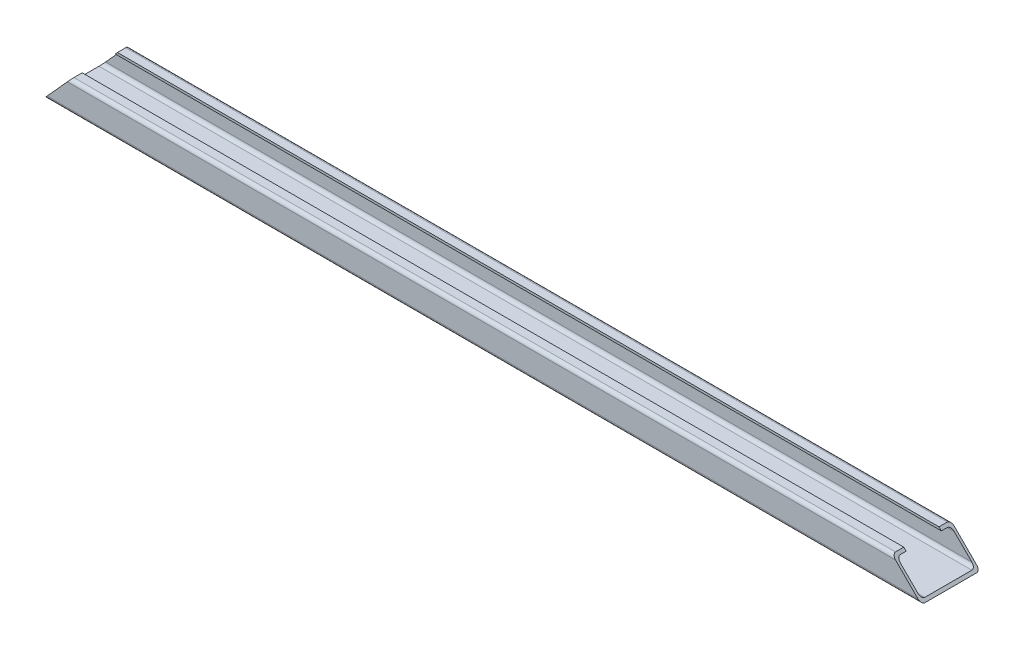
ISO-10303-21;
HEADER;
FILE_DESCRIPTION(('STEP AP214'),'2;1');
FILE_NAME('part.step','',(''),(''),'','','');
FILE_SCHEMA(('AUTOMOTIVE_DESIGN { 1 0 10303 214 1 1 1 1 }'));
ENDSEC;
DATA;
#1=APPLICATION_CONTEXT('core data for automotive mechanical design processes');
#2=APPLICATION_PROTOCOL_DEFINITION('international standard','automotive_design',2000,#1);
#3=PRODUCT_CONTEXT('',#1,'mechanical');
#4=PRODUCT('Part','Part','',(#3));
#5=PRODUCT_RELATED_PRODUCT_CATEGORY('part','',(#4));
#6=PRODUCT_DEFINITION_FORMATION('','',#4);
#7=PRODUCT_DEFINITION_CONTEXT('part definition',#1,'design');
#8=PRODUCT_DEFINITION('design','',#6,#7);
#9=PRODUCT_DEFINITION_SHAPE('','',#8);
#10=(LENGTH_UNIT() NAMED_UNIT(*) SI_UNIT(.MILLI.,.METRE.));
#11=(NAMED_UNIT(*) PLANE_ANGLE_UNIT() SI_UNIT($,.RADIAN.));
#12=(NAMED_UNIT(*) SI_UNIT($,.STERADIAN.) SOLID_ANGLE_UNIT());
#13=UNCERTAINTY_MEASURE_WITH_UNIT(LENGTH_MEASURE(1.E-05),#10,'distance_accuracy_value','');
#14=(GEOMETRIC_REPRESENTATION_CONTEXT(3) GLOBAL_UNCERTAINTY_ASSIGNED_CONTEXT((#13)) GLOBAL_UNIT_ASSIGNED_CONTEXT((#10,
#11,#12)) REPRESENTATION_CONTEXT('',''));
#15=CARTESIAN_POINT('',(0.,0.,0.));
#16=DIRECTION('',(0.,0.,1.));
#17=DIRECTION('',(1.,0.,0.));
#18=AXIS2_PLACEMENT_3D('',#15,#16,#17);
#19=CARTESIAN_POINT('',(1500.,25.,-50.));
#20=DIRECTION('',(0.,0.,1.));
#21=DIRECTION('',(0.,-1.,0.));
#22=AXIS2_PLACEMENT_3D('',#19,#20,#21);
#23=PLANE('',#22);
#24=DIRECTION('',(-1.,0.,0.));
#25=VECTOR('',#24,1.);
#26=CARTESIAN_POINT('',(1500.,-19.,-50.));
#27=LINE('',#26,#25);
#28=CARTESIAN_POINT('',(1494.,-19.,-50.));
#29=VERTEX_POINT('',#28);
#30=CARTESIAN_POINT('',(10.3822220508938,-19.,-50.));
#31=VERTEX_POINT('',#30);
#32=EDGE_CURVE('E197',#29,#31,#27,.T.);
#33=ORIENTED_EDGE('',*,*,#32,.T.);
#34=DIRECTION('',(0.669130606358863,0.74314482547739,0.));
#35=VECTOR('',#34,1.);
#36=CARTESIAN_POINT('',(49.9999999999994,25.,-50.));
#37=LINE('',#36,#35);
#38=CARTESIAN_POINT('',(44.5975757342123,19.,-50.));
#39=VERTEX_POINT('',#38);
#40=EDGE_CURVE('E176',#31,#39,#37,.T.);
#41=ORIENTED_EDGE('',*,*,#40,.T.);
#42=DIRECTION('',(-1.,0.,0.));
#43=VECTOR('',#42,1.);
#44=CARTESIAN_POINT('',(1500.,19.,-50.));
#45=LINE('',#44,#43);
#46=CARTESIAN_POINT('',(1456.,19.,-50.));
#47=VERTEX_POINT('',#46);
#48=EDGE_CURVE('E200',#39,#47,#45,.F.);
#49=ORIENTED_EDGE('',*,*,#48,.T.);
#50=DIRECTION('',(0.707106781186546,-0.707106781186549,0.));
#51=VECTOR('',#50,1.);
#52=CARTESIAN_POINT('',(1500.,-25.,-50.));
#53=LINE('',#52,#51);
#54=EDGE_CURVE('E255',#47,#29,#53,.T.);
#55=ORIENTED_EDGE('',*,*,#54,.T.);
#56=EDGE_LOOP('',(#33,#41,#49,#55));
#57=FACE_BOUND('',#56,.T.);
#58=ADVANCED_FACE('F32',(#57),#23,.F.);
#59=CARTESIAN_POINT('',(1500.,25.,-30.));
#60=DIRECTION('',(0.,-1.,0.));
#61=DIRECTION('',(0.,0.,-1.));
#62=AXIS2_PLACEMENT_3D('',#59,#60,#61);
#63=PLANE('',#62);
#64=DIRECTION('',(-1.,0.,0.));
#65=VECTOR('',#64,1.);
#66=CARTESIAN_POINT('',(1500.,25.,-44.));
#67=LINE('',#66,#65);
#68=CARTESIAN_POINT('',(1450.,25.,-44.));
#69=VERTEX_POINT('',#68);
#70=CARTESIAN_POINT('',(49.9999999999994,25.,-44.));
#71=VERTEX_POINT('',#70);
#72=EDGE_CURVE('E194',#69,#71,#67,.T.);
#73=ORIENTED_EDGE('',*,*,#72,.T.);
#74=DIRECTION('',(0.,0.,1.));
#75=VECTOR('',#74,1.);
#76=CARTESIAN_POINT('',(49.9999999999994,25.,-30.));
#77=LINE('',#76,#75);
#78=CARTESIAN_POINT('',(49.9999999999994,25.,-30.));
#79=VERTEX_POINT('',#78);
#80=EDGE_CURVE('E300',#71,#79,#77,.T.);
#81=ORIENTED_EDGE('',*,*,#80,.T.);
#82=DIRECTION('',(-1.,0.,0.));
#83=VECTOR('',#82,1.);
#84=CARTESIAN_POINT('',(1500.,25.,-30.));
#85=LINE('',#84,#83);
#86=CARTESIAN_POINT('',(1450.,25.,-30.));
#87=VERTEX_POINT('',#86);
#88=EDGE_CURVE('E317',#87,#79,#85,.T.);
#89=ORIENTED_EDGE('',*,*,#88,.F.);
#90=DIRECTION('',(0.,0.,-1.));
#91=VECTOR('',#90,1.);
#92=CARTESIAN_POINT('',(1450.,25.,-30.));
#93=LINE('',#92,#91);
#94=EDGE_CURVE('E288',#87,#69,#93,.T.);
#95=ORIENTED_EDGE('',*,*,#94,.T.);
#96=EDGE_LOOP('',(#73,#81,#89,#95));
#97=FACE_BOUND('',#96,.T.);
#98=ADVANCED_FACE('F359',(#97),#63,.F.);
#99=CARTESIAN_POINT('',(1500.,25.,-30.));
#100=DIRECTION('',(0.,0.,-1.));
#101=DIRECTION('',(-1.,0.,0.));
#102=AXIS2_PLACEMENT_3D('',#99,#100,#101);
#103=PLANE('',#102);
#104=ORIENTED_EDGE('',*,*,#88,.T.);
#105=DIRECTION('',(-0.669130606358863,-0.74314482547739,0.));
#106=VECTOR('',#105,1.);
#107=CARTESIAN_POINT('',(699.216864130961,746.028374142,-30.));
#108=LINE('',#107,#106);
#109=CARTESIAN_POINT('',(46.3983838228079,21.,-30.));
#110=VERTEX_POINT('',#109);
#111=EDGE_CURVE('E248',#79,#110,#108,.T.);
#112=ORIENTED_EDGE('',*,*,#111,.T.);
#113=DIRECTION('',(-1.,0.,0.));
#114=VECTOR('',#113,1.);
#115=CARTESIAN_POINT('',(1500.,21.,-30.));
#116=LINE('',#115,#114);
#117=CARTESIAN_POINT('',(1454.,21.,-30.));
#118=VERTEX_POINT('',#117);
#119=EDGE_CURVE('E314',#118,#110,#116,.T.);
#120=ORIENTED_EDGE('',*,*,#119,.F.);
#121=DIRECTION('',(-0.707106781186546,0.707106781186549,0.));
#122=VECTOR('',#121,1.);
#123=CARTESIAN_POINT('',(1475.,0.,-30.));
#124=LINE('',#123,#122);
#125=EDGE_CURVE('E285',#118,#87,#124,.T.);
#126=ORIENTED_EDGE('',*,*,#125,.T.);
#127=EDGE_LOOP('',(#104,#112,#120,#126));
#128=FACE_BOUND('',#127,.T.);
#129=ADVANCED_FACE('F361',(#128),#103,.F.);
#130=CARTESIAN_POINT('',(1500.,21.,-30.));
#131=DIRECTION('',(0.,1.,0.));
#132=DIRECTION('',(0.,0.,1.));
#133=AXIS2_PLACEMENT_3D('',#130,#131,#132);
#134=PLANE('',#133);
#135=ORIENTED_EDGE('',*,*,#119,.T.);
#136=DIRECTION('',(0.,0.,-1.));
#137=VECTOR('',#136,1.);
#138=CARTESIAN_POINT('',(46.3983838228079,21.,-30.));
#139=LINE('',#138,#137);
#140=CARTESIAN_POINT('',(46.3983838228079,21.,-40.));
#141=VERTEX_POINT('',#140);
#142=EDGE_CURVE('E245',#110,#141,#139,.T.);
#143=ORIENTED_EDGE('',*,*,#142,.T.);
#144=DIRECTION('',(-1.,0.,0.));
#145=VECTOR('',#144,1.);
#146=CARTESIAN_POINT('',(1500.,21.,-40.));
#147=LINE('',#146,#145);
#148=CARTESIAN_POINT('',(1454.,21.,-40.));
#149=VERTEX_POINT('',#148);
#150=EDGE_CURVE('E324',#141,#149,#147,.F.);
#151=ORIENTED_EDGE('',*,*,#150,.T.);
#152=DIRECTION('',(0.,0.,1.));
#153=VECTOR('',#152,1.);
#154=CARTESIAN_POINT('',(1454.,21.,-30.));
#155=LINE('',#154,#153);
#156=EDGE_CURVE('E282',#149,#118,#155,.T.);
#157=ORIENTED_EDGE('',*,*,#156,.T.);
#158=EDGE_LOOP('',(#135,#143,#151,#157));
#159=FACE_BOUND('',#158,.T.);
#160=ADVANCED_FACE('F365',(#159),#134,.F.);
#161=CARTESIAN_POINT('',(1500.,21.,-46.));
#162=DIRECTION('',(0.,0.,-1.));
#163=DIRECTION('',(0.,1.,0.));
#164=AXIS2_PLACEMENT_3D('',#161,#162,#163);
#165=PLANE('',#164);
#166=DIRECTION('',(-1.,0.,0.));
#167=VECTOR('',#166,1.);
#168=CARTESIAN_POINT('',(0.,15.,-46.));
#169=LINE('',#168,#167);
#170=CARTESIAN_POINT('',(1460.,15.,-46.));
#171=VERTEX_POINT('',#170);
#172=CARTESIAN_POINT('',(40.9959595570207,15.0000000000001,-46.));
#173=VERTEX_POINT('',#172);
#174=EDGE_CURVE('E321',#171,#173,#169,.T.);
#175=ORIENTED_EDGE('',*,*,#174,.T.);
#176=DIRECTION('',(-0.669130606358863,-0.74314482547739,0.));
#177=VECTOR('',#176,1.);
#178=CARTESIAN_POINT('',(697.227820340224,743.819317215464,-45.9999999999999));
#179=LINE('',#178,#177);
#180=CARTESIAN_POINT('',(13.983838228085,-15.,-46.));
#181=VERTEX_POINT('',#180);
#182=EDGE_CURVE('E237',#173,#181,#179,.T.);
#183=ORIENTED_EDGE('',*,*,#182,.T.);
#184=DIRECTION('',(-1.,0.,0.));
#185=VECTOR('',#184,1.);
#186=CARTESIAN_POINT('',(1500.,-15.,-46.));
#187=LINE('',#186,#185);
#188=CARTESIAN_POINT('',(1490.,-15.,-46.));
#189=VERTEX_POINT('',#188);
#190=EDGE_CURVE('E224',#181,#189,#187,.F.);
#191=ORIENTED_EDGE('',*,*,#190,.T.);
#192=DIRECTION('',(-0.707106781186546,0.707106781186549,0.));
#193=VECTOR('',#192,1.);
#194=CARTESIAN_POINT('',(1477.,-1.99999999999993,-46.));
#195=LINE('',#194,#193);
#196=EDGE_CURVE('E273',#189,#171,#195,.T.);
#197=ORIENTED_EDGE('',*,*,#196,.T.);
#198=EDGE_LOOP('',(#175,#183,#191,#197));
#199=FACE_BOUND('',#198,.T.);
#200=ADVANCED_FACE('F372',(#199),#165,.F.);
#201=CARTESIAN_POINT('',(1500.,-21.,46.));
#202=DIRECTION('',(0.,-1.,0.));
#203=DIRECTION('',(0.,0.,-1.));
#204=AXIS2_PLACEMENT_3D('',#201,#202,#203);
#205=PLANE('',#204);
#206=DIRECTION('',(-1.,0.,0.));
#207=VECTOR('',#206,1.);
#208=CARTESIAN_POINT('',(0.,-21.,-40.));
#209=LINE('',#208,#207);
#210=CARTESIAN_POINT('',(1496.,-21.,-40.));
#211=VERTEX_POINT('',#210);
#212=CARTESIAN_POINT('',(8.58141396229795,-21.,-40.));
#213=VERTEX_POINT('',#212);
#214=EDGE_CURVE('E40',#211,#213,#209,.T.);
#215=ORIENTED_EDGE('',*,*,#214,.T.);
#216=DIRECTION('',(0.,0.,1.));
#217=VECTOR('',#216,1.);
#218=CARTESIAN_POINT('',(8.58141396229795,-21.,46.));
#219=LINE('',#218,#217);
#220=CARTESIAN_POINT('',(8.58141396229795,-21.,40.));
#221=VERTEX_POINT('',#220);
#222=EDGE_CURVE('E213',#213,#221,#219,.T.);
#223=ORIENTED_EDGE('',*,*,#222,.T.);
#224=DIRECTION('',(-1.,0.,0.));
#225=VECTOR('',#224,1.);
#226=CARTESIAN_POINT('',(1500.,-21.,40.));
#227=LINE('',#226,#225);
#228=CARTESIAN_POINT('',(1496.,-21.,40.));
#229=VERTEX_POINT('',#228);
#230=EDGE_CURVE('E206',#221,#229,#227,.F.);
#231=ORIENTED_EDGE('',*,*,#230,.T.);
#232=DIRECTION('',(0.,0.,-1.));
#233=VECTOR('',#232,1.);
#234=CARTESIAN_POINT('',(1496.,-21.,46.));
#235=LINE('',#234,#233);
#236=EDGE_CURVE('E216',#229,#211,#235,.T.);
#237=ORIENTED_EDGE('',*,*,#236,.T.);
#238=EDGE_LOOP('',(#215,#223,#231,#237));
#239=FACE_BOUND('',#238,.T.);
#240=ADVANCED_FACE('F212',(#239),#205,.F.);
#241=CARTESIAN_POINT('',(1500.,21.,46.));
#242=DIRECTION('',(0.,0.,1.));
#243=DIRECTION('',(0.,-1.,0.));
#244=AXIS2_PLACEMENT_3D('',#241,#242,#243);
#245=PLANE('',#244);
#246=DIRECTION('',(-1.,0.,0.));
#247=VECTOR('',#246,1.);
#248=CARTESIAN_POINT('',(0.,-15.,46.));
#249=LINE('',#248,#247);
#250=CARTESIAN_POINT('',(1490.,-15.,46.));
#251=VERTEX_POINT('',#250);
#252=CARTESIAN_POINT('',(13.983838228085,-15.,46.));
#253=VERTEX_POINT('',#252);
#254=EDGE_CURVE('E188',#251,#253,#249,.T.);
#255=ORIENTED_EDGE('',*,*,#254,.T.);
#256=DIRECTION('',(0.669130606358863,0.74314482547739,0.));
#257=VECTOR('',#256,1.);
#258=CARTESIAN_POINT('',(697.227820340224,743.819317215464,46.0000000000001));
#259=LINE('',#258,#257);
#260=CARTESIAN_POINT('',(40.9959595570207,15.0000000000001,46.));
#261=VERTEX_POINT('',#260);
#262=EDGE_CURVE('E231',#253,#261,#259,.T.);
#263=ORIENTED_EDGE('',*,*,#262,.T.);
#264=DIRECTION('',(-1.,0.,0.));
#265=VECTOR('',#264,1.);
#266=CARTESIAN_POINT('',(1500.,15.,46.));
#267=LINE('',#266,#265);
#268=CARTESIAN_POINT('',(1460.,15.,46.));
#269=VERTEX_POINT('',#268);
#270=EDGE_CURVE('E184',#261,#269,#267,.F.);
#271=ORIENTED_EDGE('',*,*,#270,.T.);
#272=DIRECTION('',(0.707106781186546,-0.707106781186549,0.));
#273=VECTOR('',#272,1.);
#274=CARTESIAN_POINT('',(1477.,-1.99999999999993,46.));
#275=LINE('',#274,#273);
#276=EDGE_CURVE('E262',#269,#251,#275,.T.);
#277=ORIENTED_EDGE('',*,*,#276,.T.);
#278=EDGE_LOOP('',(#255,#263,#271,#277));
#279=FACE_BOUND('',#278,.T.);
#280=ADVANCED_FACE('F332',(#279),#245,.F.);
#281=CARTESIAN_POINT('',(1500.,21.,46.));
#282=DIRECTION('',(0.,1.,0.));
#283=DIRECTION('',(0.,0.,1.));
#284=AXIS2_PLACEMENT_3D('',#281,#282,#283);
#285=PLANE('',#284);
#286=DIRECTION('',(-1.,0.,0.));
#287=VECTOR('',#286,1.);
#288=CARTESIAN_POINT('',(0.,21.,40.));
#289=LINE('',#288,#287);
#290=CARTESIAN_POINT('',(1454.,21.,40.));
#291=VERTEX_POINT('',#290);
#292=CARTESIAN_POINT('',(46.3983838228077,21.,40.));
#293=VERTEX_POINT('',#292);
#294=EDGE_CURVE('E326',#291,#293,#289,.T.);
#295=ORIENTED_EDGE('',*,*,#294,.T.);
#296=DIRECTION('',(0.,0.,-1.));
#297=VECTOR('',#296,1.);
#298=CARTESIAN_POINT('',(46.3983838228079,21.,46.));
#299=LINE('',#298,#297);
#300=CARTESIAN_POINT('',(46.3983838228079,21.,30.));
#301=VERTEX_POINT('',#300);
#302=EDGE_CURVE('E229',#293,#301,#299,.T.);
#303=ORIENTED_EDGE('',*,*,#302,.T.);
#304=DIRECTION('',(-1.,0.,0.));
#305=VECTOR('',#304,1.);
#306=CARTESIAN_POINT('',(1500.,21.,30.));
#307=LINE('',#306,#305);
#308=CARTESIAN_POINT('',(1454.,21.,30.));
#309=VERTEX_POINT('',#308);
#310=EDGE_CURVE('E311',#309,#301,#307,.T.);
#311=ORIENTED_EDGE('',*,*,#310,.F.);
#312=DIRECTION('',(0.,0.,1.));
#313=VECTOR('',#312,1.);
#314=CARTESIAN_POINT('',(1454.,21.,46.));
#315=LINE('',#314,#313);
#316=EDGE_CURVE('E270',#309,#291,#315,.T.);
#317=ORIENTED_EDGE('',*,*,#316,.T.);
#318=EDGE_LOOP('',(#295,#303,#311,#317));
#319=FACE_BOUND('',#318,.T.);
#320=ADVANCED_FACE('F432',(#319),#285,.F.);
#321=CARTESIAN_POINT('',(1500.,25.,30.));
#322=DIRECTION('',(0.,0.,1.));
#323=DIRECTION('',(1.,0.,0.));
#324=AXIS2_PLACEMENT_3D('',#321,#322,#323);
#325=PLANE('',#324);
#326=ORIENTED_EDGE('',*,*,#310,.T.);
#327=DIRECTION('',(0.669130606358863,0.74314482547739,0.));
#328=VECTOR('',#327,1.);
#329=CARTESIAN_POINT('',(699.216864130961,746.028374142,30.));
#330=LINE('',#329,#328);
#331=CARTESIAN_POINT('',(49.9999999999994,25.,30.));
#332=VERTEX_POINT('',#331);
#333=EDGE_CURVE('E242',#301,#332,#330,.T.);
#334=ORIENTED_EDGE('',*,*,#333,.T.);
#335=DIRECTION('',(-1.,0.,0.));
#336=VECTOR('',#335,1.);
#337=CARTESIAN_POINT('',(1500.,25.,30.));
#338=LINE('',#337,#336);
#339=CARTESIAN_POINT('',(1450.,25.,30.));
#340=VERTEX_POINT('',#339);
#341=EDGE_CURVE('E308',#340,#332,#338,.T.);
#342=ORIENTED_EDGE('',*,*,#341,.F.);
#343=DIRECTION('',(0.707106781186546,-0.707106781186549,0.));
#344=VECTOR('',#343,1.);
#345=CARTESIAN_POINT('',(1475.,0.,30.));
#346=LINE('',#345,#344);
#347=EDGE_CURVE('E279',#340,#309,#346,.T.);
#348=ORIENTED_EDGE('',*,*,#347,.T.);
#349=EDGE_LOOP('',(#326,#334,#342,#348));
#350=FACE_BOUND('',#349,.T.);
#351=ADVANCED_FACE('F428',(#350),#325,.F.);
#352=CARTESIAN_POINT('',(1500.,25.,50.));
#353=DIRECTION('',(0.,-1.,0.));
#354=DIRECTION('',(0.,0.,-1.));
#355=AXIS2_PLACEMENT_3D('',#352,#353,#354);
#356=PLANE('',#355);
#357=ORIENTED_EDGE('',*,*,#341,.T.);
#358=DIRECTION('',(0.,0.,1.));
#359=VECTOR('',#358,1.);
#360=CARTESIAN_POINT('',(49.9999999999994,25.,50.));
#361=LINE('',#360,#359);
#362=CARTESIAN_POINT('',(49.9999999999994,25.,44.));
#363=VERTEX_POINT('',#362);
#364=EDGE_CURVE('E303',#332,#363,#361,.T.);
#365=ORIENTED_EDGE('',*,*,#364,.T.);
#366=DIRECTION('',(-1.,0.,0.));
#367=VECTOR('',#366,1.);
#368=CARTESIAN_POINT('',(1500.,25.,44.));
#369=LINE('',#368,#367);
#370=CARTESIAN_POINT('',(1450.,25.,44.));
#371=VERTEX_POINT('',#370);
#372=EDGE_CURVE('E186',#363,#371,#369,.F.);
#373=ORIENTED_EDGE('',*,*,#372,.T.);
#374=DIRECTION('',(0.,0.,-1.));
#375=VECTOR('',#374,1.);
#376=CARTESIAN_POINT('',(1450.,25.,50.));
#377=LINE('',#376,#375);
#378=EDGE_CURVE('E293',#371,#340,#377,.T.);
#379=ORIENTED_EDGE('',*,*,#378,.T.);
#380=EDGE_LOOP('',(#357,#365,#373,#379));
#381=FACE_BOUND('',#380,.T.);
#382=ADVANCED_FACE('F425',(#381),#356,.F.);
#383=CARTESIAN_POINT('',(1500.,25.,50.));
#384=DIRECTION('',(0.,0.,-1.));
#385=DIRECTION('',(0.,1.,0.));
#386=AXIS2_PLACEMENT_3D('',#383,#384,#385);
#387=PLANE('',#386);
#388=DIRECTION('',(-1.,0.,0.));
#389=VECTOR('',#388,1.);
#390=CARTESIAN_POINT('',(1500.,19.,50.));
#391=LINE('',#390,#389);
#392=CARTESIAN_POINT('',(1456.,19.,50.));
#393=VERTEX_POINT('',#392);
#394=CARTESIAN_POINT('',(44.5975757342123,19.,50.));
#395=VERTEX_POINT('',#394);
#396=EDGE_CURVE('E181',#393,#395,#391,.T.);
#397=ORIENTED_EDGE('',*,*,#396,.T.);
#398=DIRECTION('',(0.669130606358863,0.74314482547739,0.));
#399=VECTOR('',#398,1.);
#400=CARTESIAN_POINT('',(49.9999999999994,25.,50.));
#401=LINE('',#400,#399);
#402=CARTESIAN_POINT('',(10.3822220508938,-19.,50.));
#403=VERTEX_POINT('',#402);
#404=EDGE_CURVE('E170',#403,#395,#401,.T.);
#405=ORIENTED_EDGE('',*,*,#404,.F.);
#406=DIRECTION('',(-1.,0.,0.));
#407=VECTOR('',#406,1.);
#408=CARTESIAN_POINT('',(1500.,-19.,50.));
#409=LINE('',#408,#407);
#410=CARTESIAN_POINT('',(1494.,-19.,50.));
#411=VERTEX_POINT('',#410);
#412=EDGE_CURVE('E47',#403,#411,#409,.F.);
#413=ORIENTED_EDGE('',*,*,#412,.T.);
#414=DIRECTION('',(0.707106781186546,-0.707106781186549,0.));
#415=VECTOR('',#414,1.);
#416=CARTESIAN_POINT('',(1500.,-25.,50.));
#417=LINE('',#416,#415);
#418=EDGE_CURVE('E254',#393,#411,#417,.T.);
#419=ORIENTED_EDGE('',*,*,#418,.F.);
#420=EDGE_LOOP('',(#397,#405,#413,#419));
#421=FACE_BOUND('',#420,.T.);
#422=ADVANCED_FACE('F179',(#421),#387,.F.);
#423=CARTESIAN_POINT('',(1500.,-25.,50.));
#424=DIRECTION('',(0.,1.,0.));
#425=DIRECTION('',(0.,0.,1.));
#426=AXIS2_PLACEMENT_3D('',#423,#424,#425);
#427=PLANE('',#426);
#428=DIRECTION('',(-1.,0.,0.));
#429=VECTOR('',#428,1.);
#430=CARTESIAN_POINT('',(1500.,-25.,44.));
#431=LINE('',#430,#429);
#432=CARTESIAN_POINT('',(1500.,-25.,44.));
#433=VERTEX_POINT('',#432);
#434=CARTESIAN_POINT('',(4.97979778510649,-25.,44.));
#435=VERTEX_POINT('',#434);
#436=EDGE_CURVE('E202',#433,#435,#431,.T.);
#437=ORIENTED_EDGE('',*,*,#436,.T.);
#438=DIRECTION('',(0.,0.,-1.));
#439=VECTOR('',#438,1.);
#440=CARTESIAN_POINT('',(4.97979778510649,-25.,50.));
#441=LINE('',#440,#439);
#442=CARTESIAN_POINT('',(4.97979778510649,-25.,-44.));
#443=VERTEX_POINT('',#442);
#444=EDGE_CURVE('E172',#435,#443,#441,.T.);
#445=ORIENTED_EDGE('',*,*,#444,.T.);
#446=DIRECTION('',(-1.,0.,0.));
#447=VECTOR('',#446,1.);
#448=CARTESIAN_POINT('',(1500.,-25.,-44.));
#449=LINE('',#448,#447);
#450=CARTESIAN_POINT('',(1500.,-25.,-44.));
#451=VERTEX_POINT('',#450);
#452=EDGE_CURVE('E204',#443,#451,#449,.F.);
#453=ORIENTED_EDGE('',*,*,#452,.T.);
#454=DIRECTION('',(0.,0.,-1.));
#455=VECTOR('',#454,1.);
#456=CARTESIAN_POINT('',(1500.,-25.,50.));
#457=LINE('',#456,#455);
#458=EDGE_CURVE('E305',#433,#451,#457,.T.);
#459=ORIENTED_EDGE('',*,*,#458,.F.);
#460=EDGE_LOOP('',(#437,#445,#453,#459));
#461=FACE_BOUND('',#460,.T.);
#462=ADVANCED_FACE('F392',(#461),#427,.F.);
#463=CARTESIAN_POINT('',(1500.,15.,-40.));
#464=DIRECTION('',(1.,0.,0.));
#465=DIRECTION('',(0.,0.,-1.));
#466=AXIS2_PLACEMENT_3D('',#463,#464,#465);
#467=CYLINDRICAL_SURFACE('',#466,6.);
#468=ORIENTED_EDGE('',*,*,#150,.F.);
#469=CARTESIAN_POINT('',(40.9959595570206,15.,-40.));
#470=DIRECTION('',(0.74314482547739,-0.669130606358863,0.));
#471=DIRECTION('',(0.669130606358863,0.74314482547739,0.));
#472=AXIS2_PLACEMENT_3D('',#469,#470,#471);
#473=ELLIPSE('',#472,8.07379637763831,6.);
#474=EDGE_CURVE('E239',#141,#173,#473,.F.);
#475=ORIENTED_EDGE('',*,*,#474,.T.);
#476=ORIENTED_EDGE('',*,*,#174,.F.);
#477=CARTESIAN_POINT('',(1460.,15.,-40.));
#478=DIRECTION('',(-0.707106781186549,-0.707106781186546,0.));
#479=DIRECTION('',(0.707106781186546,-0.707106781186549,0.));
#480=AXIS2_PLACEMENT_3D('',#477,#478,#479);
#481=ELLIPSE('',#480,8.48528137423856,6.);
#482=EDGE_CURVE('E276',#171,#149,#481,.F.);
#483=ORIENTED_EDGE('',*,*,#482,.T.);
#484=EDGE_LOOP('',(#468,#475,#476,#483));
#485=FACE_BOUND('',#484,.T.);
#486=ADVANCED_FACE('F368',(#485),#467,.F.);
#487=CARTESIAN_POINT('',(1500.,15.,40.));
#488=DIRECTION('',(1.,0.,0.));
#489=DIRECTION('',(0.,0.,-1.));
#490=AXIS2_PLACEMENT_3D('',#487,#488,#489);
#491=CYLINDRICAL_SURFACE('',#490,6.);
#492=ORIENTED_EDGE('',*,*,#270,.F.);
#493=CARTESIAN_POINT('',(40.9959595570206,15.,40.));
#494=DIRECTION('',(0.74314482547739,-0.669130606358863,0.));
#495=DIRECTION('',(0.669130606358863,0.74314482547739,0.));
#496=AXIS2_PLACEMENT_3D('',#493,#494,#495);
#497=ELLIPSE('',#496,8.07379637763831,6.);
#498=EDGE_CURVE('E226',#261,#293,#497,.F.);
#499=ORIENTED_EDGE('',*,*,#498,.T.);
#500=ORIENTED_EDGE('',*,*,#294,.F.);
#501=CARTESIAN_POINT('',(1460.,15.,40.));
#502=DIRECTION('',(-0.707106781186549,-0.707106781186546,0.));
#503=DIRECTION('',(0.707106781186546,-0.707106781186549,0.));
#504=AXIS2_PLACEMENT_3D('',#501,#502,#503);
#505=ELLIPSE('',#504,8.48528137423856,6.);
#506=EDGE_CURVE('E267',#291,#269,#505,.F.);
#507=ORIENTED_EDGE('',*,*,#506,.T.);
#508=EDGE_LOOP('',(#492,#499,#500,#507));
#509=FACE_BOUND('',#508,.T.);
#510=ADVANCED_FACE('F391',(#509),#491,.F.);
#511=CARTESIAN_POINT('',(1500.,19.,44.));
#512=DIRECTION('',(-1.,0.,0.));
#513=DIRECTION('',(0.,0.,1.));
#514=AXIS2_PLACEMENT_3D('',#511,#512,#513);
#515=CYLINDRICAL_SURFACE('',#514,6.);
#516=CARTESIAN_POINT('',(44.5975757342121,19.,44.));
#517=DIRECTION('',(0.74314482547739,-0.669130606358863,0.));
#518=DIRECTION('',(-0.669130606358863,-0.74314482547739,0.));
#519=AXIS2_PLACEMENT_3D('',#516,#517,#518);
#520=ELLIPSE('',#519,8.07379637763831,6.);
#521=EDGE_CURVE('E55',#395,#363,#520,.F.);
#522=ORIENTED_EDGE('',*,*,#521,.F.);
#523=ORIENTED_EDGE('',*,*,#396,.F.);
#524=CARTESIAN_POINT('',(1456.,19.,44.));
#525=DIRECTION('',(-0.707106781186549,-0.707106781186546,0.));
#526=DIRECTION('',(-0.707106781186546,0.707106781186549,0.));
#527=AXIS2_PLACEMENT_3D('',#524,#525,#526);
#528=ELLIPSE('',#527,8.48528137423856,6.);
#529=EDGE_CURVE('E296',#371,#393,#528,.F.);
#530=ORIENTED_EDGE('',*,*,#529,.F.);
#531=ORIENTED_EDGE('',*,*,#372,.F.);
#532=EDGE_LOOP('',(#522,#523,#530,#531));
#533=FACE_BOUND('',#532,.T.);
#534=ADVANCED_FACE('F395',(#533),#515,.T.);
#535=CARTESIAN_POINT('',(1500.,19.,-44.));
#536=DIRECTION('',(-1.,0.,0.));
#537=DIRECTION('',(0.,0.,1.));
#538=AXIS2_PLACEMENT_3D('',#535,#536,#537);
#539=CYLINDRICAL_SURFACE('',#538,6.);
#540=CARTESIAN_POINT('',(44.5975757342121,19.,-44.));
#541=DIRECTION('',(0.74314482547739,-0.669130606358863,0.));
#542=DIRECTION('',(-0.669130606358863,-0.74314482547739,0.));
#543=AXIS2_PLACEMENT_3D('',#540,#541,#542);
#544=ELLIPSE('',#543,8.07379637763831,6.);
#545=EDGE_CURVE('E251',#71,#39,#544,.F.);
#546=ORIENTED_EDGE('',*,*,#545,.F.);
#547=ORIENTED_EDGE('',*,*,#72,.F.);
#548=CARTESIAN_POINT('',(1456.,19.,-44.));
#549=DIRECTION('',(-0.707106781186549,-0.707106781186546,0.));
#550=DIRECTION('',(-0.707106781186546,0.707106781186549,0.));
#551=AXIS2_PLACEMENT_3D('',#548,#549,#550);
#552=ELLIPSE('',#551,8.48528137423856,6.);
#553=EDGE_CURVE('E291',#47,#69,#552,.F.);
#554=ORIENTED_EDGE('',*,*,#553,.F.);
#555=ORIENTED_EDGE('',*,*,#48,.F.);
#556=EDGE_LOOP('',(#546,#547,#554,#555));
#557=FACE_BOUND('',#556,.T.);
#558=ADVANCED_FACE('F353',(#557),#539,.T.);
#559=CARTESIAN_POINT('',(1500.,-19.,-44.));
#560=DIRECTION('',(-1.,0.,0.));
#561=DIRECTION('',(0.,0.,1.));
#562=AXIS2_PLACEMENT_3D('',#559,#560,#561);
#563=CYLINDRICAL_SURFACE('',#562,6.);
#564=CARTESIAN_POINT('',(10.3822220508936,-19.,-44.));
#565=DIRECTION('',(0.74314482547739,-0.669130606358863,0.));
#566=DIRECTION('',(-0.669130606358863,-0.74314482547739,0.));
#567=AXIS2_PLACEMENT_3D('',#564,#565,#566);
#568=ELLIPSE('',#567,8.07379637763831,6.);
#569=EDGE_CURVE('E339',#31,#443,#568,.F.);
#570=ORIENTED_EDGE('',*,*,#569,.F.);
#571=ORIENTED_EDGE('',*,*,#32,.F.);
#572=CARTESIAN_POINT('',(1494.,-19.,-44.));
#573=DIRECTION('',(-0.707106781186549,-0.707106781186546,0.));
#574=DIRECTION('',(-0.707106781186546,0.707106781186549,0.));
#575=AXIS2_PLACEMENT_3D('',#572,#573,#574);
#576=ELLIPSE('',#575,8.48528137423856,6.);
#577=EDGE_CURVE('E298',#451,#29,#576,.F.);
#578=ORIENTED_EDGE('',*,*,#577,.F.);
#579=ORIENTED_EDGE('',*,*,#452,.F.);
#580=EDGE_LOOP('',(#570,#571,#578,#579));
#581=FACE_BOUND('',#580,.T.);
#582=ADVANCED_FACE('F402',(#581),#563,.T.);
#583=CARTESIAN_POINT('',(1500.,-15.,-40.));
#584=DIRECTION('',(1.,0.,0.));
#585=DIRECTION('',(0.,0.,-1.));
#586=AXIS2_PLACEMENT_3D('',#583,#584,#585);
#587=CYLINDRICAL_SURFACE('',#586,6.);
#588=ORIENTED_EDGE('',*,*,#190,.F.);
#589=CARTESIAN_POINT('',(13.983838228085,-15.,-40.));
#590=DIRECTION('',(0.74314482547739,-0.669130606358863,0.));
#591=DIRECTION('',(0.669130606358863,0.74314482547739,0.));
#592=AXIS2_PLACEMENT_3D('',#589,#590,#591);
#593=ELLIPSE('',#592,8.07379637763831,6.);
#594=EDGE_CURVE('E223',#181,#213,#593,.F.);
#595=ORIENTED_EDGE('',*,*,#594,.T.);
#596=ORIENTED_EDGE('',*,*,#214,.F.);
#597=CARTESIAN_POINT('',(1490.,-15.,-40.));
#598=DIRECTION('',(-0.707106781186549,-0.707106781186546,0.));
#599=DIRECTION('',(0.707106781186546,-0.707106781186549,0.));
#600=AXIS2_PLACEMENT_3D('',#597,#598,#599);
#601=ELLIPSE('',#600,8.48528137423856,6.);
#602=EDGE_CURVE('E222',#211,#189,#601,.F.);
#603=ORIENTED_EDGE('',*,*,#602,.T.);
#604=EDGE_LOOP('',(#588,#595,#596,#603));
#605=FACE_BOUND('',#604,.T.);
#606=ADVANCED_FACE('F221',(#605),#587,.F.);
#607=CARTESIAN_POINT('',(1500.,-15.,40.));
#608=DIRECTION('',(1.,0.,0.));
#609=DIRECTION('',(0.,0.,-1.));
#610=AXIS2_PLACEMENT_3D('',#607,#608,#609);
#611=CYLINDRICAL_SURFACE('',#610,6.);
#612=ORIENTED_EDGE('',*,*,#230,.F.);
#613=CARTESIAN_POINT('',(13.983838228085,-15.,40.));
#614=DIRECTION('',(0.74314482547739,-0.669130606358863,0.));
#615=DIRECTION('',(0.669130606358863,0.74314482547739,0.));
#616=AXIS2_PLACEMENT_3D('',#613,#614,#615);
#617=ELLIPSE('',#616,8.07379637763831,6.);
#618=EDGE_CURVE('E338',#221,#253,#617,.F.);
#619=ORIENTED_EDGE('',*,*,#618,.T.);
#620=ORIENTED_EDGE('',*,*,#254,.F.);
#621=CARTESIAN_POINT('',(1490.,-15.,40.));
#622=DIRECTION('',(-0.707106781186549,-0.707106781186546,0.));
#623=DIRECTION('',(0.707106781186546,-0.707106781186549,0.));
#624=AXIS2_PLACEMENT_3D('',#621,#622,#623);
#625=ELLIPSE('',#624,8.48528137423856,6.);
#626=EDGE_CURVE('E258',#251,#229,#625,.F.);
#627=ORIENTED_EDGE('',*,*,#626,.T.);
#628=EDGE_LOOP('',(#612,#619,#620,#627));
#629=FACE_BOUND('',#628,.T.);
#630=ADVANCED_FACE('F337',(#629),#611,.F.);
#631=CARTESIAN_POINT('',(1500.,-19.,44.));
#632=DIRECTION('',(-1.,0.,0.));
#633=DIRECTION('',(0.,0.,1.));
#634=AXIS2_PLACEMENT_3D('',#631,#632,#633);
#635=CYLINDRICAL_SURFACE('',#634,6.);
#636=CARTESIAN_POINT('',(10.3822220508936,-19.,44.));
#637=DIRECTION('',(0.74314482547739,-0.669130606358863,0.));
#638=DIRECTION('',(-0.669130606358863,-0.74314482547739,0.));
#639=AXIS2_PLACEMENT_3D('',#636,#637,#638);
#640=ELLIPSE('',#639,8.07379637763831,6.);
#641=EDGE_CURVE('E168',#435,#403,#640,.F.);
#642=ORIENTED_EDGE('',*,*,#641,.F.);
#643=ORIENTED_EDGE('',*,*,#436,.F.);
#644=CARTESIAN_POINT('',(1494.,-19.,44.));
#645=DIRECTION('',(-0.707106781186549,-0.707106781186546,0.));
#646=DIRECTION('',(-0.707106781186546,0.707106781186549,0.));
#647=AXIS2_PLACEMENT_3D('',#644,#645,#646);
#648=ELLIPSE('',#647,8.48528137423856,6.);
#649=EDGE_CURVE('E11',#411,#433,#648,.F.);
#650=ORIENTED_EDGE('',*,*,#649,.F.);
#651=ORIENTED_EDGE('',*,*,#412,.F.);
#652=EDGE_LOOP('',(#642,#643,#650,#651));
#653=FACE_BOUND('',#652,.T.);
#654=ADVANCED_FACE('F34',(#653),#635,.T.);
#655=CARTESIAN_POINT('',(1500.,-25.,-50.));
#656=DIRECTION('',(-0.707106781186549,-0.707106781186546,0.));
#657=DIRECTION('',(0.707106781186546,-0.707106781186549,0.));
#658=AXIS2_PLACEMENT_3D('',#655,#656,#657);
#659=PLANE('',#658);
#660=ORIENTED_EDGE('',*,*,#577,.T.);
#661=ORIENTED_EDGE('',*,*,#54,.F.);
#662=ORIENTED_EDGE('',*,*,#553,.T.);
#663=ORIENTED_EDGE('',*,*,#94,.F.);
#664=ORIENTED_EDGE('',*,*,#125,.F.);
#665=ORIENTED_EDGE('',*,*,#156,.F.);
#666=ORIENTED_EDGE('',*,*,#482,.F.);
#667=ORIENTED_EDGE('',*,*,#196,.F.);
#668=ORIENTED_EDGE('',*,*,#602,.F.);
#669=ORIENTED_EDGE('',*,*,#236,.F.);
#670=ORIENTED_EDGE('',*,*,#626,.F.);
#671=ORIENTED_EDGE('',*,*,#276,.F.);
#672=ORIENTED_EDGE('',*,*,#506,.F.);
#673=ORIENTED_EDGE('',*,*,#316,.F.);
#674=ORIENTED_EDGE('',*,*,#347,.F.);
#675=ORIENTED_EDGE('',*,*,#378,.F.);
#676=ORIENTED_EDGE('',*,*,#529,.T.);
#677=ORIENTED_EDGE('',*,*,#418,.T.);
#678=ORIENTED_EDGE('',*,*,#649,.T.);
#679=ORIENTED_EDGE('',*,*,#458,.T.);
#680=EDGE_LOOP('',(#660,#661,#662,#663,#664,#665,#666,#667,#668,#669,#670,#671,#672,#673,#674,
#675,#676,#677,#678,#679));
#681=FACE_BOUND('',#680,.T.);
#682=ADVANCED_FACE('F356',(#681),#659,.F.);
#683=CARTESIAN_POINT('',(49.9999999999994,25.,-50.));
#684=DIRECTION('',(0.74314482547739,-0.669130606358863,0.));
#685=DIRECTION('',(0.669130606358863,0.74314482547739,0.));
#686=AXIS2_PLACEMENT_3D('',#683,#684,#685);
#687=PLANE('',#686);
#688=ORIENTED_EDGE('',*,*,#521,.T.);
#689=ORIENTED_EDGE('',*,*,#364,.F.);
#690=ORIENTED_EDGE('',*,*,#333,.F.);
#691=ORIENTED_EDGE('',*,*,#302,.F.);
#692=ORIENTED_EDGE('',*,*,#498,.F.);
#693=ORIENTED_EDGE('',*,*,#262,.F.);
#694=ORIENTED_EDGE('',*,*,#618,.F.);
#695=ORIENTED_EDGE('',*,*,#222,.F.);
#696=ORIENTED_EDGE('',*,*,#594,.F.);
#697=ORIENTED_EDGE('',*,*,#182,.F.);
#698=ORIENTED_EDGE('',*,*,#474,.F.);
#699=ORIENTED_EDGE('',*,*,#142,.F.);
#700=ORIENTED_EDGE('',*,*,#111,.F.);
#701=ORIENTED_EDGE('',*,*,#80,.F.);
#702=ORIENTED_EDGE('',*,*,#545,.T.);
#703=ORIENTED_EDGE('',*,*,#40,.F.);
#704=ORIENTED_EDGE('',*,*,#569,.T.);
#705=ORIENTED_EDGE('',*,*,#444,.F.);
#706=ORIENTED_EDGE('',*,*,#641,.T.);
#707=ORIENTED_EDGE('',*,*,#404,.T.);
#708=EDGE_LOOP('',(#688,#689,#690,#691,#692,#693,#694,#695,#696,#697,#698,#699,#700,#701,#702,
#703,#704,#705,#706,#707));
#709=FACE_BOUND('',#708,.T.);
#710=ADVANCED_FACE('F169',(#709),#687,.F.);
#711=CLOSED_SHELL('',(#58,#98,#129,#160,#200,#240,#280,#320,#351,#382,#422,#462,#486,#510,#534,
#558,#582,#606,#630,#654,#682,#710));
#712=MANIFOLD_SOLID_BREP('B2',#711);
#713=ADVANCED_BREP_SHAPE_REPRESENTATION('',(#18,#712),#14);
#714=SHAPE_DEFINITION_REPRESENTATION(#9,#713);
ENDSEC;
END-ISO-10303-21;
